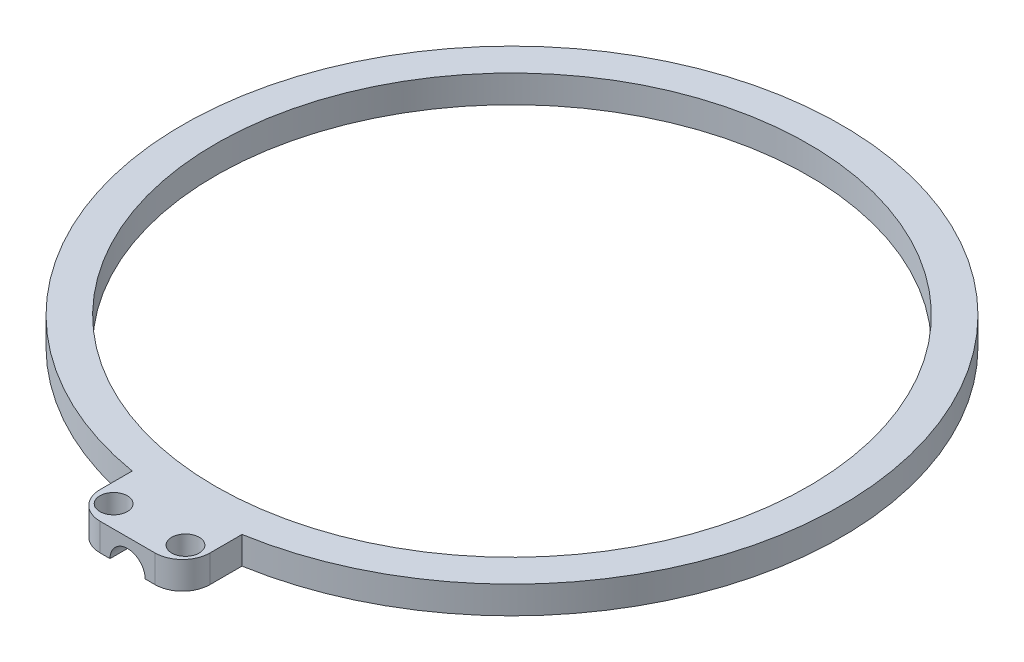
ISO-10303-21;
HEADER;
FILE_DESCRIPTION(('STEP AP214'),'2;1');
FILE_NAME('part.step','',(''),(''),'','','');
FILE_SCHEMA(('AUTOMOTIVE_DESIGN { 1 0 10303 214 1 1 1 1 }'));
ENDSEC;
DATA;
#1=APPLICATION_CONTEXT('core data for automotive mechanical design processes');
#2=APPLICATION_PROTOCOL_DEFINITION('international standard','automotive_design',2000,#1);
#3=PRODUCT_CONTEXT('',#1,'mechanical');
#4=PRODUCT('Part','Part','',(#3));
#5=PRODUCT_RELATED_PRODUCT_CATEGORY('part','',(#4));
#6=PRODUCT_DEFINITION_FORMATION('','',#4);
#7=PRODUCT_DEFINITION_CONTEXT('part definition',#1,'design');
#8=PRODUCT_DEFINITION('design','',#6,#7);
#9=PRODUCT_DEFINITION_SHAPE('','',#8);
#10=(LENGTH_UNIT() NAMED_UNIT(*) SI_UNIT(.MILLI.,.METRE.));
#11=(NAMED_UNIT(*) PLANE_ANGLE_UNIT() SI_UNIT($,.RADIAN.));
#12=(NAMED_UNIT(*) SI_UNIT($,.STERADIAN.) SOLID_ANGLE_UNIT());
#13=UNCERTAINTY_MEASURE_WITH_UNIT(LENGTH_MEASURE(1.E-05),#10,'distance_accuracy_value','');
#14=(GEOMETRIC_REPRESENTATION_CONTEXT(3) GLOBAL_UNCERTAINTY_ASSIGNED_CONTEXT((#13)) GLOBAL_UNIT_ASSIGNED_CONTEXT((#10,
#11,#12)) REPRESENTATION_CONTEXT('',''));
#15=CARTESIAN_POINT('',(0.,0.,0.));
#16=DIRECTION('',(0.,0.,1.));
#17=DIRECTION('',(1.,0.,0.));
#18=AXIS2_PLACEMENT_3D('',#15,#16,#17);
#19=CARTESIAN_POINT('',(0.,3.175,0.));
#20=DIRECTION('',(0.,1.,0.));
#21=DIRECTION('',(0.,0.,1.));
#22=AXIS2_PLACEMENT_3D('',#19,#20,#21);
#23=PLANE('',#22);
#24=CARTESIAN_POINT('',(-8.30579999999999,3.17499999999999,83.82));
#25=DIRECTION('',(0.,-1.,0.));
#26=DIRECTION('',(0.,0.,-1.));
#27=AXIS2_PLACEMENT_3D('',#24,#25,#26);
#28=CIRCLE('',#27,3.17499999999999);
#29=CARTESIAN_POINT('',(-8.30579999999999,3.17499999999999,80.645));
#30=VERTEX_POINT('',#29);
#31=EDGE_CURVE('E372',#30,#30,#28,.T.);
#32=ORIENTED_EDGE('',*,*,#31,.T.);
#33=EDGE_LOOP('',(#32));
#34=FACE_BOUND('',#33,.T.);
#35=CARTESIAN_POINT('',(8.3058,3.17499999999999,83.82));
#36=DIRECTION('',(0.,-1.,0.));
#37=DIRECTION('',(0.,0.,-1.));
#38=AXIS2_PLACEMENT_3D('',#35,#36,#37);
#39=CIRCLE('',#38,3.17499999999999);
#40=CARTESIAN_POINT('',(8.3058,3.17499999999999,80.645));
#41=VERTEX_POINT('',#40);
#42=EDGE_CURVE('E131',#41,#41,#39,.T.);
#43=ORIENTED_EDGE('',*,*,#42,.T.);
#44=EDGE_LOOP('',(#43));
#45=FACE_BOUND('',#44,.T.);
#46=DIRECTION('',(1.,0.,0.));
#47=VECTOR('',#46,1.);
#48=CARTESIAN_POINT('',(-12.7,3.175,88.9));
#49=LINE('',#48,#47);
#50=CARTESIAN_POINT('',(-6.34999999999999,3.175,88.9));
#51=VERTEX_POINT('',#50);
#52=CARTESIAN_POINT('',(6.35000000000001,3.175,88.9));
#53=VERTEX_POINT('',#52);
#54=EDGE_CURVE('E133',#51,#53,#49,.T.);
#55=ORIENTED_EDGE('',*,*,#54,.T.);
#56=CARTESIAN_POINT('',(6.35000000000001,3.175,82.55));
#57=DIRECTION('',(0.,1.,0.));
#58=DIRECTION('',(0.,0.,1.));
#59=AXIS2_PLACEMENT_3D('',#56,#57,#58);
#60=CIRCLE('',#59,6.35);
#61=CARTESIAN_POINT('',(12.7,3.175,82.55));
#62=VERTEX_POINT('',#61);
#63=EDGE_CURVE('E189',#53,#62,#60,.T.);
#64=ORIENTED_EDGE('',*,*,#63,.T.);
#65=DIRECTION('',(0.,0.,-1.));
#66=VECTOR('',#65,1.);
#67=CARTESIAN_POINT('',(12.7,3.175,88.9));
#68=LINE('',#67,#66);
#69=CARTESIAN_POINT('',(12.7,3.175,75.1342132453651));
#70=VERTEX_POINT('',#69);
#71=EDGE_CURVE('E149',#62,#70,#68,.T.);
#72=ORIENTED_EDGE('',*,*,#71,.T.);
#73=CARTESIAN_POINT('',(0.,3.175,0.));
#74=DIRECTION('',(0.,1.,0.));
#75=DIRECTION('',(0.,0.,1.));
#76=AXIS2_PLACEMENT_3D('',#73,#74,#75);
#77=CIRCLE('',#76,76.2);
#78=CARTESIAN_POINT('',(-12.7,3.175,75.1342132453651));
#79=VERTEX_POINT('',#78);
#80=EDGE_CURVE('E172',#70,#79,#77,.T.);
#81=ORIENTED_EDGE('',*,*,#80,.T.);
#82=DIRECTION('',(0.,0.,1.));
#83=VECTOR('',#82,1.);
#84=CARTESIAN_POINT('',(-12.7,3.175,88.9));
#85=LINE('',#84,#83);
#86=CARTESIAN_POINT('',(-12.7,3.175,82.55));
#87=VERTEX_POINT('',#86);
#88=EDGE_CURVE('E152',#79,#87,#85,.T.);
#89=ORIENTED_EDGE('',*,*,#88,.T.);
#90=CARTESIAN_POINT('',(-6.34999999999999,3.175,82.55));
#91=DIRECTION('',(0.,1.,0.));
#92=DIRECTION('',(0.,0.,1.));
#93=AXIS2_PLACEMENT_3D('',#90,#91,#92);
#94=CIRCLE('',#93,6.35);
#95=EDGE_CURVE('E186',#87,#51,#94,.T.);
#96=ORIENTED_EDGE('',*,*,#95,.T.);
#97=EDGE_LOOP('',(#55,#64,#72,#81,#89,#96));
#98=FACE_BOUND('',#97,.T.);
#99=CARTESIAN_POINT('',(0.,3.175,0.));
#100=DIRECTION('',(0.,1.,0.));
#101=DIRECTION('',(0.,0.,1.));
#102=AXIS2_PLACEMENT_3D('',#99,#100,#101);
#103=CIRCLE('',#102,68.58);
#104=CARTESIAN_POINT('',(0.,3.175,68.58));
#105=VERTEX_POINT('',#104);
#106=EDGE_CURVE('E164',#105,#105,#103,.T.);
#107=ORIENTED_EDGE('',*,*,#106,.F.);
#108=EDGE_LOOP('',(#107));
#109=FACE_BOUND('',#108,.T.);
#110=ADVANCED_FACE('F40',(#34,#45,#98,#109),#23,.T.);
#111=CARTESIAN_POINT('',(0.,-3.175,0.));
#112=DIRECTION('',(0.,1.,0.));
#113=DIRECTION('',(0.,0.,1.));
#114=AXIS2_PLACEMENT_3D('',#111,#112,#113);
#115=PLANE('',#114);
#116=CARTESIAN_POINT('',(-8.30579999999999,-3.175,83.82));
#117=DIRECTION('',(0.,-1.,0.));
#118=DIRECTION('',(0.,0.,-1.));
#119=AXIS2_PLACEMENT_3D('',#116,#117,#118);
#120=CIRCLE('',#119,3.17499999999999);
#121=CARTESIAN_POINT('',(-8.30579999999999,-3.175,80.645));
#122=VERTEX_POINT('',#121);
#123=EDGE_CURVE('E375',#122,#122,#120,.T.);
#124=ORIENTED_EDGE('',*,*,#123,.F.);
#125=EDGE_LOOP('',(#124));
#126=FACE_BOUND('',#125,.T.);
#127=CARTESIAN_POINT('',(8.3058,-3.175,83.82));
#128=DIRECTION('',(0.,-1.,0.));
#129=DIRECTION('',(0.,0.,-1.));
#130=AXIS2_PLACEMENT_3D('',#127,#128,#129);
#131=CIRCLE('',#130,3.17499999999999);
#132=CARTESIAN_POINT('',(8.3058,-3.175,80.645));
#133=VERTEX_POINT('',#132);
#134=EDGE_CURVE('E380',#133,#133,#131,.T.);
#135=ORIENTED_EDGE('',*,*,#134,.F.);
#136=EDGE_LOOP('',(#135));
#137=FACE_BOUND('',#136,.T.);
#138=DIRECTION('',(1.,0.,0.));
#139=VECTOR('',#138,1.);
#140=CARTESIAN_POINT('',(-4.064,-3.175,77.47));
#141=LINE('',#140,#139);
#142=CARTESIAN_POINT('',(-4.064,-3.175,77.47));
#143=VERTEX_POINT('',#142);
#144=CARTESIAN_POINT('',(4.064,-3.175,77.47));
#145=VERTEX_POINT('',#144);
#146=EDGE_CURVE('E115',#143,#145,#141,.T.);
#147=ORIENTED_EDGE('',*,*,#146,.F.);
#148=DIRECTION('',(0.,0.,1.));
#149=VECTOR('',#148,1.);
#150=CARTESIAN_POINT('',(-4.064,-3.175,77.47));
#151=LINE('',#150,#149);
#152=CARTESIAN_POINT('',(-4.064,-3.175,88.9));
#153=VERTEX_POINT('',#152);
#154=EDGE_CURVE('E106',#143,#153,#151,.T.);
#155=ORIENTED_EDGE('',*,*,#154,.T.);
#156=DIRECTION('',(1.,0.,0.));
#157=VECTOR('',#156,1.);
#158=CARTESIAN_POINT('',(-12.7,-3.175,88.9));
#159=LINE('',#158,#157);
#160=CARTESIAN_POINT('',(-6.34999999999999,-3.175,88.9));
#161=VERTEX_POINT('',#160);
#162=EDGE_CURVE('E135',#161,#153,#159,.T.);
#163=ORIENTED_EDGE('',*,*,#162,.F.);
#164=CARTESIAN_POINT('',(-6.34999999999999,-3.175,82.55));
#165=DIRECTION('',(0.,1.,0.));
#166=DIRECTION('',(0.,0.,1.));
#167=AXIS2_PLACEMENT_3D('',#164,#165,#166);
#168=CIRCLE('',#167,6.35);
#169=CARTESIAN_POINT('',(-12.7,-3.175,82.55));
#170=VERTEX_POINT('',#169);
#171=EDGE_CURVE('E64',#161,#170,#168,.F.);
#172=ORIENTED_EDGE('',*,*,#171,.T.);
#173=DIRECTION('',(0.,0.,1.));
#174=VECTOR('',#173,1.);
#175=CARTESIAN_POINT('',(-12.7,-3.175,88.9));
#176=LINE('',#175,#174);
#177=CARTESIAN_POINT('',(-12.7,-3.175,75.1342132453651));
#178=VERTEX_POINT('',#177);
#179=EDGE_CURVE('E142',#178,#170,#176,.T.);
#180=ORIENTED_EDGE('',*,*,#179,.F.);
#181=CARTESIAN_POINT('',(0.,-3.175,0.));
#182=DIRECTION('',(0.,1.,0.));
#183=DIRECTION('',(0.,0.,1.));
#184=AXIS2_PLACEMENT_3D('',#181,#182,#183);
#185=CIRCLE('',#184,76.2);
#186=CARTESIAN_POINT('',(12.7,-3.175,75.1342132453651));
#187=VERTEX_POINT('',#186);
#188=EDGE_CURVE('E168',#187,#178,#185,.T.);
#189=ORIENTED_EDGE('',*,*,#188,.F.);
#190=DIRECTION('',(0.,0.,-1.));
#191=VECTOR('',#190,1.);
#192=CARTESIAN_POINT('',(12.7,-3.175,88.9));
#193=LINE('',#192,#191);
#194=CARTESIAN_POINT('',(12.7,-3.175,82.55));
#195=VERTEX_POINT('',#194);
#196=EDGE_CURVE('E138',#195,#187,#193,.T.);
#197=ORIENTED_EDGE('',*,*,#196,.F.);
#198=CARTESIAN_POINT('',(6.35000000000001,-3.175,82.55));
#199=DIRECTION('',(0.,1.,0.));
#200=DIRECTION('',(0.,0.,1.));
#201=AXIS2_PLACEMENT_3D('',#198,#199,#200);
#202=CIRCLE('',#201,6.35);
#203=CARTESIAN_POINT('',(6.35000000000001,-3.175,88.9));
#204=VERTEX_POINT('',#203);
#205=EDGE_CURVE('E49',#195,#204,#202,.F.);
#206=ORIENTED_EDGE('',*,*,#205,.T.);
#207=CARTESIAN_POINT('',(4.064,-3.175,88.9));
#208=VERTEX_POINT('',#207);
#209=EDGE_CURVE('E139',#208,#204,#159,.T.);
#210=ORIENTED_EDGE('',*,*,#209,.F.);
#211=DIRECTION('',(0.,0.,1.));
#212=VECTOR('',#211,1.);
#213=CARTESIAN_POINT('',(4.064,-3.175,77.47));
#214=LINE('',#213,#212);
#215=EDGE_CURVE('E56',#145,#208,#214,.T.);
#216=ORIENTED_EDGE('',*,*,#215,.F.);
#217=EDGE_LOOP('',(#147,#155,#163,#172,#180,#189,#197,#206,#210,#216));
#218=FACE_BOUND('',#217,.T.);
#219=CARTESIAN_POINT('',(0.,-3.175,0.));
#220=DIRECTION('',(0.,1.,0.));
#221=DIRECTION('',(0.,0.,1.));
#222=AXIS2_PLACEMENT_3D('',#219,#220,#221);
#223=CIRCLE('',#222,68.58);
#224=CARTESIAN_POINT('',(0.,-3.175,68.58));
#225=VERTEX_POINT('',#224);
#226=EDGE_CURVE('E160',#225,#225,#223,.T.);
#227=ORIENTED_EDGE('',*,*,#226,.T.);
#228=EDGE_LOOP('',(#227));
#229=FACE_BOUND('',#228,.T.);
#230=ADVANCED_FACE('F121',(#126,#137,#218,#229),#115,.F.);
#231=CARTESIAN_POINT('',(0.,3.175,0.));
#232=DIRECTION('',(0.,-1.,0.));
#233=DIRECTION('',(0.,0.,-1.));
#234=AXIS2_PLACEMENT_3D('',#231,#232,#233);
#235=CYLINDRICAL_SURFACE('',#234,76.2);
#236=ORIENTED_EDGE('',*,*,#188,.T.);
#237=DIRECTION('',(0.,1.,0.));
#238=VECTOR('',#237,1.);
#239=CARTESIAN_POINT('',(-12.7,-3.175,75.1342132453651));
#240=LINE('',#239,#238);
#241=EDGE_CURVE('E156',#178,#79,#240,.T.);
#242=ORIENTED_EDGE('',*,*,#241,.T.);
#243=ORIENTED_EDGE('',*,*,#80,.F.);
#244=DIRECTION('',(0.,1.,0.));
#245=VECTOR('',#244,1.);
#246=CARTESIAN_POINT('',(12.7,-3.175,75.1342132453651));
#247=LINE('',#246,#245);
#248=EDGE_CURVE('E145',#187,#70,#247,.T.);
#249=ORIENTED_EDGE('',*,*,#248,.F.);
#250=EDGE_LOOP('',(#236,#242,#243,#249));
#251=FACE_BOUND('',#250,.T.);
#252=ADVANCED_FACE('F219',(#251),#235,.T.);
#253=CARTESIAN_POINT('',(0.,3.175,0.));
#254=DIRECTION('',(0.,-1.,0.));
#255=DIRECTION('',(0.,0.,-1.));
#256=AXIS2_PLACEMENT_3D('',#253,#254,#255);
#257=CYLINDRICAL_SURFACE('',#256,68.58);
#258=ORIENTED_EDGE('',*,*,#106,.T.);
#259=EDGE_LOOP('',(#258));
#260=FACE_BOUND('',#259,.T.);
#261=ORIENTED_EDGE('',*,*,#226,.F.);
#262=EDGE_LOOP('',(#261));
#263=FACE_BOUND('',#262,.T.);
#264=ADVANCED_FACE('F242',(#260,#263),#257,.F.);
#265=CARTESIAN_POINT('',(-12.7,-3.175,88.9));
#266=DIRECTION('',(0.,0.,1.));
#267=DIRECTION('',(1.,0.,0.));
#268=AXIS2_PLACEMENT_3D('',#265,#266,#267);
#269=PLANE('',#268);
#270=CARTESIAN_POINT('',(0.,-3.175,88.9));
#271=DIRECTION('',(0.,0.,1.));
#272=DIRECTION('',(1.,0.,0.));
#273=AXIS2_PLACEMENT_3D('',#270,#271,#272);
#274=CIRCLE('',#273,4.064);
#275=EDGE_CURVE('E111',#208,#153,#274,.T.);
#276=ORIENTED_EDGE('',*,*,#275,.F.);
#277=ORIENTED_EDGE('',*,*,#209,.T.);
#278=DIRECTION('',(0.,1.,0.));
#279=VECTOR('',#278,1.);
#280=CARTESIAN_POINT('',(6.35000000000001,-3.175,88.9));
#281=LINE('',#280,#279);
#282=EDGE_CURVE('E182',#204,#53,#281,.T.);
#283=ORIENTED_EDGE('',*,*,#282,.T.);
#284=ORIENTED_EDGE('',*,*,#54,.F.);
#285=DIRECTION('',(0.,1.,0.));
#286=VECTOR('',#285,1.);
#287=CARTESIAN_POINT('',(-6.34999999999999,-3.175,88.9));
#288=LINE('',#287,#286);
#289=EDGE_CURVE('E176',#51,#161,#288,.F.);
#290=ORIENTED_EDGE('',*,*,#289,.T.);
#291=ORIENTED_EDGE('',*,*,#162,.T.);
#292=EDGE_LOOP('',(#276,#277,#283,#284,#290,#291));
#293=FACE_BOUND('',#292,.T.);
#294=ADVANCED_FACE('F208',(#293),#269,.T.);
#295=CARTESIAN_POINT('',(-12.7,-3.175,88.9));
#296=DIRECTION('',(-1.,0.,0.));
#297=DIRECTION('',(0.,0.,1.));
#298=AXIS2_PLACEMENT_3D('',#295,#296,#297);
#299=PLANE('',#298);
#300=ORIENTED_EDGE('',*,*,#179,.T.);
#301=DIRECTION('',(0.,1.,0.));
#302=VECTOR('',#301,1.);
#303=CARTESIAN_POINT('',(-12.7,-3.175,82.55));
#304=LINE('',#303,#302);
#305=EDGE_CURVE('E11',#170,#87,#304,.T.);
#306=ORIENTED_EDGE('',*,*,#305,.T.);
#307=ORIENTED_EDGE('',*,*,#88,.F.);
#308=ORIENTED_EDGE('',*,*,#241,.F.);
#309=EDGE_LOOP('',(#300,#306,#307,#308));
#310=FACE_BOUND('',#309,.T.);
#311=ADVANCED_FACE('F216',(#310),#299,.T.);
#312=CARTESIAN_POINT('',(12.7,-3.175,88.9));
#313=DIRECTION('',(1.,0.,0.));
#314=DIRECTION('',(0.,0.,-1.));
#315=AXIS2_PLACEMENT_3D('',#312,#313,#314);
#316=PLANE('',#315);
#317=ORIENTED_EDGE('',*,*,#71,.F.);
#318=DIRECTION('',(0.,1.,0.));
#319=VECTOR('',#318,1.);
#320=CARTESIAN_POINT('',(12.7,-3.175,82.55));
#321=LINE('',#320,#319);
#322=EDGE_CURVE('E192',#62,#195,#321,.F.);
#323=ORIENTED_EDGE('',*,*,#322,.T.);
#324=ORIENTED_EDGE('',*,*,#196,.T.);
#325=ORIENTED_EDGE('',*,*,#248,.T.);
#326=EDGE_LOOP('',(#317,#323,#324,#325));
#327=FACE_BOUND('',#326,.T.);
#328=ADVANCED_FACE('F222',(#327),#316,.T.);
#329=CARTESIAN_POINT('',(6.35000000000001,-3.175,82.55));
#330=DIRECTION('',(0.,1.,0.));
#331=DIRECTION('',(0.,0.,1.));
#332=AXIS2_PLACEMENT_3D('',#329,#330,#331);
#333=CYLINDRICAL_SURFACE('',#332,6.35);
#334=ORIENTED_EDGE('',*,*,#205,.F.);
#335=ORIENTED_EDGE('',*,*,#322,.F.);
#336=ORIENTED_EDGE('',*,*,#63,.F.);
#337=ORIENTED_EDGE('',*,*,#282,.F.);
#338=EDGE_LOOP('',(#334,#335,#336,#337));
#339=FACE_BOUND('',#338,.T.);
#340=ADVANCED_FACE('F205',(#339),#333,.T.);
#341=CARTESIAN_POINT('',(-6.34999999999999,-3.175,82.55));
#342=DIRECTION('',(0.,1.,0.));
#343=DIRECTION('',(0.,0.,1.));
#344=AXIS2_PLACEMENT_3D('',#341,#342,#343);
#345=CYLINDRICAL_SURFACE('',#344,6.35);
#346=ORIENTED_EDGE('',*,*,#171,.F.);
#347=ORIENTED_EDGE('',*,*,#289,.F.);
#348=ORIENTED_EDGE('',*,*,#95,.F.);
#349=ORIENTED_EDGE('',*,*,#305,.F.);
#350=EDGE_LOOP('',(#346,#347,#348,#349));
#351=FACE_BOUND('',#350,.T.);
#352=ADVANCED_FACE('F42',(#351),#345,.T.);
#353=CARTESIAN_POINT('',(0.,-3.175,77.47));
#354=DIRECTION('',(0.,0.,1.));
#355=DIRECTION('',(1.,0.,0.));
#356=AXIS2_PLACEMENT_3D('',#353,#354,#355);
#357=CYLINDRICAL_SURFACE('',#356,4.064);
#358=ORIENTED_EDGE('',*,*,#275,.T.);
#359=ORIENTED_EDGE('',*,*,#154,.F.);
#360=CARTESIAN_POINT('',(0.,-3.175,77.47));
#361=DIRECTION('',(0.,0.,1.));
#362=DIRECTION('',(1.,0.,0.));
#363=AXIS2_PLACEMENT_3D('',#360,#361,#362);
#364=CIRCLE('',#363,4.064);
#365=EDGE_CURVE('E109',#145,#143,#364,.T.);
#366=ORIENTED_EDGE('',*,*,#365,.F.);
#367=ORIENTED_EDGE('',*,*,#215,.T.);
#368=EDGE_LOOP('',(#358,#359,#366,#367));
#369=FACE_BOUND('',#368,.T.);
#370=ADVANCED_FACE('F108',(#369),#357,.F.);
#371=CARTESIAN_POINT('',(0.,-3.175,77.47));
#372=DIRECTION('',(0.,0.,1.));
#373=DIRECTION('',(1.,0.,0.));
#374=AXIS2_PLACEMENT_3D('',#371,#372,#373);
#375=PLANE('',#374);
#376=ORIENTED_EDGE('',*,*,#365,.T.);
#377=ORIENTED_EDGE('',*,*,#146,.T.);
#378=EDGE_LOOP('',(#376,#377));
#379=FACE_BOUND('',#378,.T.);
#380=ADVANCED_FACE('F118',(#379),#375,.T.);
#381=CARTESIAN_POINT('',(8.3058,-3.175,83.82));
#382=DIRECTION('',(0.,-1.,0.));
#383=DIRECTION('',(0.,0.,-1.));
#384=AXIS2_PLACEMENT_3D('',#381,#382,#383);
#385=CYLINDRICAL_SURFACE('',#384,3.17499999999999);
#386=ORIENTED_EDGE('',*,*,#42,.F.);
#387=EDGE_LOOP('',(#386));
#388=FACE_BOUND('',#387,.T.);
#389=ORIENTED_EDGE('',*,*,#134,.T.);
#390=EDGE_LOOP('',(#389));
#391=FACE_BOUND('',#390,.T.);
#392=ADVANCED_FACE('F296',(#388,#391),#385,.F.);
#393=CARTESIAN_POINT('',(-8.30579999999999,-3.175,83.82));
#394=DIRECTION('',(0.,-1.,0.));
#395=DIRECTION('',(0.,0.,-1.));
#396=AXIS2_PLACEMENT_3D('',#393,#394,#395);
#397=CYLINDRICAL_SURFACE('',#396,3.17499999999999);
#398=ORIENTED_EDGE('',*,*,#31,.F.);
#399=EDGE_LOOP('',(#398));
#400=FACE_BOUND('',#399,.T.);
#401=ORIENTED_EDGE('',*,*,#123,.T.);
#402=EDGE_LOOP('',(#401));
#403=FACE_BOUND('',#402,.T.);
#404=ADVANCED_FACE('F306',(#400,#403),#397,.F.);
#405=CLOSED_SHELL('',(#110,#230,#252,#264,#294,#311,#328,#340,#352,#370,#380,#392,#404));
#406=MANIFOLD_SOLID_BREP('B2',#405);
#407=ADVANCED_BREP_SHAPE_REPRESENTATION('',(#18,#406),#14);
#408=SHAPE_DEFINITION_REPRESENTATION(#9,#407);
ENDSEC;
END-ISO-10303-21;
